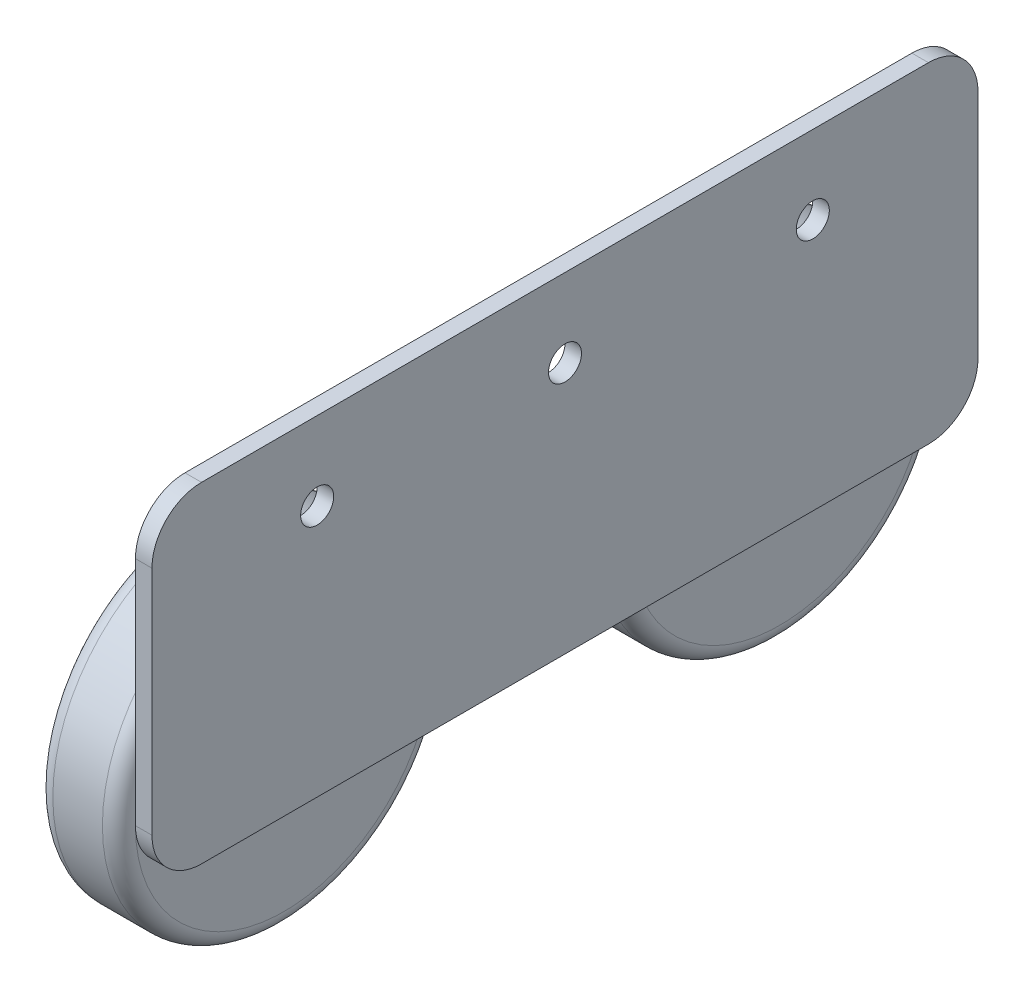
ISO-10303-21;
HEADER;
FILE_DESCRIPTION(('STEP AP214'),'2;1');
FILE_NAME('part.step','',(''),(''),'','','');
FILE_SCHEMA(('AUTOMOTIVE_DESIGN { 1 0 10303 214 1 1 1 1 }'));
ENDSEC;
DATA;
#1=APPLICATION_CONTEXT('core data for automotive mechanical design processes');
#2=APPLICATION_PROTOCOL_DEFINITION('international standard','automotive_design',2000,#1);
#3=PRODUCT_CONTEXT('',#1,'mechanical');
#4=PRODUCT('Part','Part','',(#3));
#5=PRODUCT_RELATED_PRODUCT_CATEGORY('part','',(#4));
#6=PRODUCT_DEFINITION_FORMATION('','',#4);
#7=PRODUCT_DEFINITION_CONTEXT('part definition',#1,'design');
#8=PRODUCT_DEFINITION('design','',#6,#7);
#9=PRODUCT_DEFINITION_SHAPE('','',#8);
#10=(LENGTH_UNIT() NAMED_UNIT(*) SI_UNIT(.MILLI.,.METRE.));
#11=(NAMED_UNIT(*) PLANE_ANGLE_UNIT() SI_UNIT($,.RADIAN.));
#12=(NAMED_UNIT(*) SI_UNIT($,.STERADIAN.) SOLID_ANGLE_UNIT());
#13=UNCERTAINTY_MEASURE_WITH_UNIT(LENGTH_MEASURE(1.E-05),#10,'distance_accuracy_value','');
#14=(GEOMETRIC_REPRESENTATION_CONTEXT(3) GLOBAL_UNCERTAINTY_ASSIGNED_CONTEXT((#13)) GLOBAL_UNIT_ASSIGNED_CONTEXT((#10,
#11,#12)) REPRESENTATION_CONTEXT('',''));
#15=CARTESIAN_POINT('',(0.,0.,0.));
#16=DIRECTION('',(0.,0.,1.));
#17=DIRECTION('',(1.,0.,0.));
#18=AXIS2_PLACEMENT_3D('',#15,#16,#17);
#19=CARTESIAN_POINT('',(-0.999999999999997,10.,50.));
#20=DIRECTION('',(1.,0.,0.));
#21=DIRECTION('',(0.,0.,-1.));
#22=AXIS2_PLACEMENT_3D('',#19,#20,#21);
#23=PLANE('',#22);
#24=CARTESIAN_POINT('',(-0.999999999999997,5.26091463908772,40.));
#25=DIRECTION('',(1.,0.,0.));
#26=DIRECTION('',(0.,0.,-1.));
#27=AXIS2_PLACEMENT_3D('',#24,#25,#26);
#28=CIRCLE('',#27,0.999999999999998);
#29=CARTESIAN_POINT('',(-0.999999999999997,5.26091463908772,39.));
#30=VERTEX_POINT('',#29);
#31=EDGE_CURVE('E390',#30,#30,#28,.T.);
#32=ORIENTED_EDGE('',*,*,#31,.T.);
#33=EDGE_LOOP('',(#32));
#34=FACE_BOUND('',#33,.T.);
#35=CARTESIAN_POINT('',(-0.999999999999997,5.26091463908772,25.));
#36=DIRECTION('',(1.,0.,0.));
#37=DIRECTION('',(0.,0.,-1.));
#38=AXIS2_PLACEMENT_3D('',#35,#36,#37);
#39=CIRCLE('',#38,1.);
#40=CARTESIAN_POINT('',(-0.999999999999997,5.26091463908772,24.));
#41=VERTEX_POINT('',#40);
#42=EDGE_CURVE('E384',#41,#41,#39,.T.);
#43=ORIENTED_EDGE('',*,*,#42,.T.);
#44=EDGE_LOOP('',(#43));
#45=FACE_BOUND('',#44,.T.);
#46=CARTESIAN_POINT('',(-0.999999999999997,5.26091463908772,10.));
#47=DIRECTION('',(1.,0.,0.));
#48=DIRECTION('',(0.,0.,-1.));
#49=AXIS2_PLACEMENT_3D('',#46,#47,#48);
#50=CIRCLE('',#49,1.);
#51=CARTESIAN_POINT('',(-0.999999999999997,5.26091463908772,9.));
#52=VERTEX_POINT('',#51);
#53=EDGE_CURVE('E378',#52,#52,#50,.T.);
#54=ORIENTED_EDGE('',*,*,#53,.T.);
#55=EDGE_LOOP('',(#54));
#56=FACE_BOUND('',#55,.T.);
#57=CARTESIAN_POINT('',(-0.999999999999997,-8.,40.));
#58=DIRECTION('',(1.,0.,0.));
#59=DIRECTION('',(0.,0.,-1.));
#60=AXIS2_PLACEMENT_3D('',#57,#58,#59);
#61=CIRCLE('',#60,1.);
#62=CARTESIAN_POINT('',(-0.999999999999997,-8.,39.));
#63=VERTEX_POINT('',#62);
#64=EDGE_CURVE('E366',#63,#63,#61,.T.);
#65=ORIENTED_EDGE('',*,*,#64,.T.);
#66=EDGE_LOOP('',(#65));
#67=FACE_BOUND('',#66,.T.);
#68=DIRECTION('',(0.,-1.,0.));
#69=VECTOR('',#68,1.);
#70=CARTESIAN_POINT('',(-0.999999999999997,10.,0.));
#71=LINE('',#70,#69);
#72=CARTESIAN_POINT('',(-0.999999999999997,7.,0.));
#73=VERTEX_POINT('',#72);
#74=CARTESIAN_POINT('',(-0.999999999999997,-7.,0.));
#75=VERTEX_POINT('',#74);
#76=EDGE_CURVE('E163',#73,#75,#71,.T.);
#77=ORIENTED_EDGE('',*,*,#76,.T.);
#78=CARTESIAN_POINT('',(-0.999999999999997,-7.,3.));
#79=DIRECTION('',(1.,0.,0.));
#80=DIRECTION('',(0.,0.,-1.));
#81=AXIS2_PLACEMENT_3D('',#78,#79,#80);
#82=CIRCLE('',#81,3.);
#83=CARTESIAN_POINT('',(-0.999999999999997,-10.,3.));
#84=VERTEX_POINT('',#83);
#85=EDGE_CURVE('E148',#75,#84,#82,.F.);
#86=ORIENTED_EDGE('',*,*,#85,.T.);
#87=DIRECTION('',(0.,0.,-1.));
#88=VECTOR('',#87,1.);
#89=CARTESIAN_POINT('',(-0.999999999999997,-10.,50.));
#90=LINE('',#89,#88);
#91=CARTESIAN_POINT('',(-0.999999999999997,-10.,47.));
#92=VERTEX_POINT('',#91);
#93=EDGE_CURVE('E123',#92,#84,#90,.T.);
#94=ORIENTED_EDGE('',*,*,#93,.F.);
#95=CARTESIAN_POINT('',(-0.999999999999997,-7.,47.));
#96=DIRECTION('',(1.,0.,0.));
#97=DIRECTION('',(0.,0.,-1.));
#98=AXIS2_PLACEMENT_3D('',#95,#96,#97);
#99=CIRCLE('',#98,3.);
#100=CARTESIAN_POINT('',(-0.999999999999997,-7.,50.));
#101=VERTEX_POINT('',#100);
#102=EDGE_CURVE('E128',#92,#101,#99,.F.);
#103=ORIENTED_EDGE('',*,*,#102,.T.);
#104=DIRECTION('',(0.,-1.,0.));
#105=VECTOR('',#104,1.);
#106=CARTESIAN_POINT('',(-0.999999999999997,10.,50.));
#107=LINE('',#106,#105);
#108=CARTESIAN_POINT('',(-0.999999999999997,7.,50.));
#109=VERTEX_POINT('',#108);
#110=EDGE_CURVE('E124',#109,#101,#107,.T.);
#111=ORIENTED_EDGE('',*,*,#110,.F.);
#112=CARTESIAN_POINT('',(-0.999999999999997,7.,47.));
#113=DIRECTION('',(1.,0.,0.));
#114=DIRECTION('',(0.,0.,-1.));
#115=AXIS2_PLACEMENT_3D('',#112,#113,#114);
#116=CIRCLE('',#115,3.);
#117=CARTESIAN_POINT('',(-0.999999999999997,10.,47.));
#118=VERTEX_POINT('',#117);
#119=EDGE_CURVE('E59',#109,#118,#116,.F.);
#120=ORIENTED_EDGE('',*,*,#119,.T.);
#121=DIRECTION('',(0.,0.,-1.));
#122=VECTOR('',#121,1.);
#123=CARTESIAN_POINT('',(-0.999999999999997,10.,50.));
#124=LINE('',#123,#122);
#125=CARTESIAN_POINT('',(-0.999999999999997,10.,3.));
#126=VERTEX_POINT('',#125);
#127=EDGE_CURVE('E173',#118,#126,#124,.T.);
#128=ORIENTED_EDGE('',*,*,#127,.T.);
#129=CARTESIAN_POINT('',(-0.999999999999997,7.,3.));
#130=DIRECTION('',(1.,0.,0.));
#131=DIRECTION('',(0.,0.,-1.));
#132=AXIS2_PLACEMENT_3D('',#129,#130,#131);
#133=CIRCLE('',#132,3.);
#134=EDGE_CURVE('E51',#126,#73,#133,.F.);
#135=ORIENTED_EDGE('',*,*,#134,.T.);
#136=EDGE_LOOP('',(#77,#86,#94,#103,#111,#120,#128,#135));
#137=FACE_BOUND('',#136,.T.);
#138=CARTESIAN_POINT('',(-0.999999999999997,-8.,10.));
#139=DIRECTION('',(1.,0.,0.));
#140=DIRECTION('',(0.,0.,-1.));
#141=AXIS2_PLACEMENT_3D('',#138,#139,#140);
#142=CIRCLE('',#141,1.);
#143=CARTESIAN_POINT('',(-0.999999999999997,-8.,9.));
#144=VERTEX_POINT('',#143);
#145=EDGE_CURVE('E178',#144,#144,#142,.F.);
#146=ORIENTED_EDGE('',*,*,#145,.F.);
#147=EDGE_LOOP('',(#146));
#148=FACE_BOUND('',#147,.T.);
#149=ADVANCED_FACE('F36',(#34,#45,#56,#67,#137,#148),#23,.F.);
#150=CARTESIAN_POINT('',(0.,10.,50.));
#151=DIRECTION('',(-1.,0.,0.));
#152=DIRECTION('',(0.,0.,1.));
#153=AXIS2_PLACEMENT_3D('',#150,#151,#152);
#154=PLANE('',#153);
#155=CARTESIAN_POINT('',(0.,5.26091463908772,40.));
#156=DIRECTION('',(-1.,0.,0.));
#157=DIRECTION('',(0.,0.,-1.));
#158=AXIS2_PLACEMENT_3D('',#155,#156,#157);
#159=CIRCLE('',#158,0.999999999999998);
#160=CARTESIAN_POINT('',(0.,5.26091463908772,39.));
#161=VERTEX_POINT('',#160);
#162=EDGE_CURVE('E392',#161,#161,#159,.T.);
#163=ORIENTED_EDGE('',*,*,#162,.T.);
#164=EDGE_LOOP('',(#163));
#165=FACE_BOUND('',#164,.T.);
#166=CARTESIAN_POINT('',(0.,5.26091463908772,25.));
#167=DIRECTION('',(-1.,0.,0.));
#168=DIRECTION('',(0.,0.,1.));
#169=AXIS2_PLACEMENT_3D('',#166,#167,#168);
#170=CIRCLE('',#169,1.);
#171=CARTESIAN_POINT('',(0.,5.26091463908772,26.));
#172=VERTEX_POINT('',#171);
#173=EDGE_CURVE('E387',#172,#172,#170,.T.);
#174=ORIENTED_EDGE('',*,*,#173,.T.);
#175=EDGE_LOOP('',(#174));
#176=FACE_BOUND('',#175,.T.);
#177=CARTESIAN_POINT('',(0.,5.26091463908772,10.));
#178=DIRECTION('',(-1.,0.,0.));
#179=DIRECTION('',(0.,0.,1.));
#180=AXIS2_PLACEMENT_3D('',#177,#178,#179);
#181=CIRCLE('',#180,1.);
#182=CARTESIAN_POINT('',(0.,5.26091463908772,11.));
#183=VERTEX_POINT('',#182);
#184=EDGE_CURVE('E381',#183,#183,#181,.T.);
#185=ORIENTED_EDGE('',*,*,#184,.T.);
#186=EDGE_LOOP('',(#185));
#187=FACE_BOUND('',#186,.T.);
#188=DIRECTION('',(0.,0.,-1.));
#189=VECTOR('',#188,1.);
#190=CARTESIAN_POINT('',(0.,-10.,50.));
#191=LINE('',#190,#189);
#192=CARTESIAN_POINT('',(0.,-10.,47.));
#193=VERTEX_POINT('',#192);
#194=CARTESIAN_POINT('',(0.,-10.,3.));
#195=VERTEX_POINT('',#194);
#196=EDGE_CURVE('E106',#193,#195,#191,.T.);
#197=ORIENTED_EDGE('',*,*,#196,.T.);
#198=CARTESIAN_POINT('',(0.,-7.,3.));
#199=DIRECTION('',(-1.,0.,0.));
#200=DIRECTION('',(0.,0.,1.));
#201=AXIS2_PLACEMENT_3D('',#198,#199,#200);
#202=CIRCLE('',#201,3.);
#203=CARTESIAN_POINT('',(0.,-7.,0.));
#204=VERTEX_POINT('',#203);
#205=EDGE_CURVE('E139',#195,#204,#202,.F.);
#206=ORIENTED_EDGE('',*,*,#205,.T.);
#207=DIRECTION('',(0.,1.,0.));
#208=VECTOR('',#207,1.);
#209=CARTESIAN_POINT('',(0.,10.,0.));
#210=LINE('',#209,#208);
#211=CARTESIAN_POINT('',(0.,7.,0.));
#212=VERTEX_POINT('',#211);
#213=EDGE_CURVE('E167',#204,#212,#210,.T.);
#214=ORIENTED_EDGE('',*,*,#213,.T.);
#215=CARTESIAN_POINT('',(0.,7.,3.));
#216=DIRECTION('',(-1.,0.,0.));
#217=DIRECTION('',(0.,0.,1.));
#218=AXIS2_PLACEMENT_3D('',#215,#216,#217);
#219=CIRCLE('',#218,3.);
#220=CARTESIAN_POINT('',(0.,10.,3.));
#221=VERTEX_POINT('',#220);
#222=EDGE_CURVE('E112',#212,#221,#219,.F.);
#223=ORIENTED_EDGE('',*,*,#222,.T.);
#224=DIRECTION('',(0.,0.,-1.));
#225=VECTOR('',#224,1.);
#226=CARTESIAN_POINT('',(0.,10.,50.));
#227=LINE('',#226,#225);
#228=CARTESIAN_POINT('',(0.,10.,47.));
#229=VERTEX_POINT('',#228);
#230=EDGE_CURVE('E175',#229,#221,#227,.T.);
#231=ORIENTED_EDGE('',*,*,#230,.F.);
#232=CARTESIAN_POINT('',(0.,7.,47.));
#233=DIRECTION('',(-1.,0.,0.));
#234=DIRECTION('',(0.,0.,1.));
#235=AXIS2_PLACEMENT_3D('',#232,#233,#234);
#236=CIRCLE('',#235,3.);
#237=CARTESIAN_POINT('',(0.,7.,50.));
#238=VERTEX_POINT('',#237);
#239=EDGE_CURVE('E113',#229,#238,#236,.F.);
#240=ORIENTED_EDGE('',*,*,#239,.T.);
#241=DIRECTION('',(0.,1.,0.));
#242=VECTOR('',#241,1.);
#243=CARTESIAN_POINT('',(0.,10.,50.));
#244=LINE('',#243,#242);
#245=CARTESIAN_POINT('',(0.,-7.,50.));
#246=VERTEX_POINT('',#245);
#247=EDGE_CURVE('E108',#246,#238,#244,.T.);
#248=ORIENTED_EDGE('',*,*,#247,.F.);
#249=CARTESIAN_POINT('',(0.,-7.,47.));
#250=DIRECTION('',(-1.,0.,0.));
#251=DIRECTION('',(0.,0.,1.));
#252=AXIS2_PLACEMENT_3D('',#249,#250,#251);
#253=CIRCLE('',#252,3.);
#254=EDGE_CURVE('E103',#246,#193,#253,.F.);
#255=ORIENTED_EDGE('',*,*,#254,.T.);
#256=EDGE_LOOP('',(#197,#206,#214,#223,#231,#240,#248,#255));
#257=FACE_BOUND('',#256,.T.);
#258=ADVANCED_FACE('F105',(#165,#176,#187,#257),#154,.F.);
#259=CARTESIAN_POINT('',(0.,10.,50.));
#260=DIRECTION('',(0.,-1.,0.));
#261=DIRECTION('',(0.,0.,-1.));
#262=AXIS2_PLACEMENT_3D('',#259,#260,#261);
#263=PLANE('',#262);
#264=ORIENTED_EDGE('',*,*,#230,.T.);
#265=DIRECTION('',(-1.,0.,0.));
#266=VECTOR('',#265,1.);
#267=CARTESIAN_POINT('',(-0.999999999999997,10.,3.));
#268=LINE('',#267,#266);
#269=EDGE_CURVE('E152',#221,#126,#268,.T.);
#270=ORIENTED_EDGE('',*,*,#269,.T.);
#271=ORIENTED_EDGE('',*,*,#127,.F.);
#272=DIRECTION('',(-1.,0.,0.));
#273=VECTOR('',#272,1.);
#274=CARTESIAN_POINT('',(0.,10.,47.));
#275=LINE('',#274,#273);
#276=EDGE_CURVE('E150',#118,#229,#275,.F.);
#277=ORIENTED_EDGE('',*,*,#276,.T.);
#278=EDGE_LOOP('',(#264,#270,#271,#277));
#279=FACE_BOUND('',#278,.T.);
#280=ADVANCED_FACE('F263',(#279),#263,.F.);
#281=CARTESIAN_POINT('',(0.,-10.,50.));
#282=DIRECTION('',(0.,1.,0.));
#283=DIRECTION('',(0.,0.,1.));
#284=AXIS2_PLACEMENT_3D('',#281,#282,#283);
#285=PLANE('',#284);
#286=ORIENTED_EDGE('',*,*,#93,.T.);
#287=DIRECTION('',(1.,0.,0.));
#288=VECTOR('',#287,1.);
#289=CARTESIAN_POINT('',(0.,-10.,3.));
#290=LINE('',#289,#288);
#291=EDGE_CURVE('E122',#84,#195,#290,.T.);
#292=ORIENTED_EDGE('',*,*,#291,.T.);
#293=ORIENTED_EDGE('',*,*,#196,.F.);
#294=DIRECTION('',(1.,0.,0.));
#295=VECTOR('',#294,1.);
#296=CARTESIAN_POINT('',(0.,-10.,47.));
#297=LINE('',#296,#295);
#298=EDGE_CURVE('E119',#193,#92,#297,.F.);
#299=ORIENTED_EDGE('',*,*,#298,.T.);
#300=EDGE_LOOP('',(#286,#292,#293,#299));
#301=FACE_BOUND('',#300,.T.);
#302=ADVANCED_FACE('F118',(#301),#285,.F.);
#303=CARTESIAN_POINT('',(0.,0.,50.));
#304=DIRECTION('',(0.,0.,-1.));
#305=DIRECTION('',(-1.,0.,0.));
#306=AXIS2_PLACEMENT_3D('',#303,#304,#305);
#307=PLANE('',#306);
#308=ORIENTED_EDGE('',*,*,#110,.T.);
#309=DIRECTION('',(1.,0.,0.));
#310=VECTOR('',#309,1.);
#311=CARTESIAN_POINT('',(0.,-7.,50.));
#312=LINE('',#311,#310);
#313=EDGE_CURVE('E12',#101,#246,#312,.T.);
#314=ORIENTED_EDGE('',*,*,#313,.T.);
#315=ORIENTED_EDGE('',*,*,#247,.T.);
#316=DIRECTION('',(-1.,0.,0.));
#317=VECTOR('',#316,1.);
#318=CARTESIAN_POINT('',(0.,7.,50.));
#319=LINE('',#318,#317);
#320=EDGE_CURVE('E44',#238,#109,#319,.T.);
#321=ORIENTED_EDGE('',*,*,#320,.T.);
#322=EDGE_LOOP('',(#308,#314,#315,#321));
#323=FACE_BOUND('',#322,.T.);
#324=ADVANCED_FACE('F157',(#323),#307,.F.);
#325=CARTESIAN_POINT('',(0.,0.,0.));
#326=DIRECTION('',(0.,0.,-1.));
#327=DIRECTION('',(-1.,0.,0.));
#328=AXIS2_PLACEMENT_3D('',#325,#326,#327);
#329=PLANE('',#328);
#330=ORIENTED_EDGE('',*,*,#213,.F.);
#331=DIRECTION('',(1.,0.,0.));
#332=VECTOR('',#331,1.);
#333=CARTESIAN_POINT('',(-0.999999999999997,-7.,0.));
#334=LINE('',#333,#332);
#335=EDGE_CURVE('E143',#204,#75,#334,.F.);
#336=ORIENTED_EDGE('',*,*,#335,.T.);
#337=ORIENTED_EDGE('',*,*,#76,.F.);
#338=DIRECTION('',(-1.,0.,0.));
#339=VECTOR('',#338,1.);
#340=CARTESIAN_POINT('',(0.,7.,0.));
#341=LINE('',#340,#339);
#342=EDGE_CURVE('E141',#73,#212,#341,.F.);
#343=ORIENTED_EDGE('',*,*,#342,.T.);
#344=EDGE_LOOP('',(#330,#336,#337,#343));
#345=FACE_BOUND('',#344,.T.);
#346=ADVANCED_FACE('F327',(#345),#329,.T.);
#347=CARTESIAN_POINT('',(-2.,-8.,10.));
#348=DIRECTION('',(1.,0.,0.));
#349=DIRECTION('',(0.,0.,-1.));
#350=AXIS2_PLACEMENT_3D('',#347,#348,#349);
#351=CYLINDRICAL_SURFACE('',#350,1.);
#352=CARTESIAN_POINT('',(-2.,-8.,10.));
#353=DIRECTION('',(-1.,0.,0.));
#354=DIRECTION('',(0.,0.,1.));
#355=AXIS2_PLACEMENT_3D('',#352,#353,#354);
#356=CIRCLE('',#355,1.);
#357=CARTESIAN_POINT('',(-2.,-8.,11.));
#358=VERTEX_POINT('',#357);
#359=EDGE_CURVE('E170',#358,#358,#356,.T.);
#360=ORIENTED_EDGE('',*,*,#359,.F.);
#361=EDGE_LOOP('',(#360));
#362=FACE_BOUND('',#361,.T.);
#363=ORIENTED_EDGE('',*,*,#145,.T.);
#364=EDGE_LOOP('',(#363));
#365=FACE_BOUND('',#364,.T.);
#366=ADVANCED_FACE('F331',(#362,#365),#351,.T.);
#367=CARTESIAN_POINT('',(-2.,-8.,10.));
#368=DIRECTION('',(-1.,0.,0.));
#369=DIRECTION('',(0.,0.,1.));
#370=AXIS2_PLACEMENT_3D('',#367,#368,#369);
#371=PLANE('',#370);
#372=CARTESIAN_POINT('',(-2.,-8.,10.));
#373=DIRECTION('',(-1.,0.,0.));
#374=DIRECTION('',(0.,0.,1.));
#375=AXIS2_PLACEMENT_3D('',#372,#373,#374);
#376=CIRCLE('',#375,9.);
#377=CARTESIAN_POINT('',(-2.,-8.,19.));
#378=VERTEX_POINT('',#377);
#379=EDGE_CURVE('E193',#378,#378,#376,.F.);
#380=ORIENTED_EDGE('',*,*,#379,.T.);
#381=EDGE_LOOP('',(#380));
#382=FACE_BOUND('',#381,.T.);
#383=ORIENTED_EDGE('',*,*,#359,.T.);
#384=EDGE_LOOP('',(#383));
#385=FACE_BOUND('',#384,.T.);
#386=ADVANCED_FACE('F336',(#382,#385),#371,.F.);
#387=CARTESIAN_POINT('',(-7.,-8.,10.));
#388=DIRECTION('',(1.,0.,0.));
#389=DIRECTION('',(0.,0.,-1.));
#390=AXIS2_PLACEMENT_3D('',#387,#388,#389);
#391=CYLINDRICAL_SURFACE('',#390,10.);
#392=CARTESIAN_POINT('',(-3.,-8.,10.));
#393=DIRECTION('',(-1.,0.,0.));
#394=DIRECTION('',(0.,0.,1.));
#395=AXIS2_PLACEMENT_3D('',#392,#393,#394);
#396=CIRCLE('',#395,10.);
#397=CARTESIAN_POINT('',(-3.,-8.,20.));
#398=VERTEX_POINT('',#397);
#399=EDGE_CURVE('E190',#398,#398,#396,.T.);
#400=ORIENTED_EDGE('',*,*,#399,.T.);
#401=EDGE_LOOP('',(#400));
#402=FACE_BOUND('',#401,.T.);
#403=CARTESIAN_POINT('',(-6.,-8.,10.));
#404=DIRECTION('',(-1.,0.,0.));
#405=DIRECTION('',(0.,0.,1.));
#406=AXIS2_PLACEMENT_3D('',#403,#404,#405);
#407=CIRCLE('',#406,10.);
#408=CARTESIAN_POINT('',(-6.,-8.,20.));
#409=VERTEX_POINT('',#408);
#410=EDGE_CURVE('E187',#409,#409,#407,.F.);
#411=ORIENTED_EDGE('',*,*,#410,.T.);
#412=EDGE_LOOP('',(#411));
#413=FACE_BOUND('',#412,.T.);
#414=ADVANCED_FACE('F341',(#402,#413),#391,.T.);
#415=CARTESIAN_POINT('',(20.6274169979695,-8.,10.));
#416=DIRECTION('',(-1.,0.,0.));
#417=DIRECTION('',(0.,0.,1.));
#418=AXIS2_PLACEMENT_3D('',#415,#416,#417);
#419=CYLINDRICAL_SURFACE('',#418,1.5);
#420=CARTESIAN_POINT('',(-6.,-8.,10.));
#421=DIRECTION('',(-1.,0.,0.));
#422=DIRECTION('',(0.,0.,1.));
#423=AXIS2_PLACEMENT_3D('',#420,#421,#422);
#424=CIRCLE('',#423,1.5);
#425=CARTESIAN_POINT('',(-6.,-8.,11.5));
#426=VERTEX_POINT('',#425);
#427=EDGE_CURVE('E184',#426,#426,#424,.F.);
#428=ORIENTED_EDGE('',*,*,#427,.T.);
#429=EDGE_LOOP('',(#428));
#430=FACE_BOUND('',#429,.T.);
#431=CARTESIAN_POINT('',(-5.,-8.,10.));
#432=DIRECTION('',(-1.,0.,0.));
#433=DIRECTION('',(0.,0.,1.));
#434=AXIS2_PLACEMENT_3D('',#431,#432,#433);
#435=CIRCLE('',#434,1.5);
#436=CARTESIAN_POINT('',(-5.,-8.,11.5));
#437=VERTEX_POINT('',#436);
#438=EDGE_CURVE('E364',#437,#437,#435,.F.);
#439=ORIENTED_EDGE('',*,*,#438,.F.);
#440=EDGE_LOOP('',(#439));
#441=FACE_BOUND('',#440,.T.);
#442=ADVANCED_FACE('F344',(#430,#441),#419,.T.);
#443=CARTESIAN_POINT('',(-5.,-8.,10.));
#444=DIRECTION('',(-1.,0.,0.));
#445=DIRECTION('',(0.,0.,1.));
#446=AXIS2_PLACEMENT_3D('',#443,#444,#445);
#447=PLANE('',#446);
#448=CARTESIAN_POINT('',(-5.,-8.,10.));
#449=DIRECTION('',(-1.,0.,0.));
#450=DIRECTION('',(0.,0.,1.));
#451=AXIS2_PLACEMENT_3D('',#448,#449,#450);
#452=CIRCLE('',#451,7.);
#453=CARTESIAN_POINT('',(-5.,-8.,17.));
#454=VERTEX_POINT('',#453);
#455=EDGE_CURVE('E202',#454,#454,#452,.T.);
#456=ORIENTED_EDGE('',*,*,#455,.T.);
#457=EDGE_LOOP('',(#456));
#458=FACE_BOUND('',#457,.T.);
#459=ORIENTED_EDGE('',*,*,#438,.T.);
#460=EDGE_LOOP('',(#459));
#461=FACE_BOUND('',#460,.T.);
#462=ADVANCED_FACE('F351',(#458,#461),#447,.T.);
#463=CARTESIAN_POINT('',(-7.,-8.,10.));
#464=DIRECTION('',(-1.,0.,0.));
#465=DIRECTION('',(0.,0.,1.));
#466=AXIS2_PLACEMENT_3D('',#463,#464,#465);
#467=PLANE('',#466);
#468=CARTESIAN_POINT('',(-7.,-8.,10.));
#469=DIRECTION('',(-1.,0.,0.));
#470=DIRECTION('',(0.,0.,1.));
#471=AXIS2_PLACEMENT_3D('',#468,#469,#470);
#472=CIRCLE('',#471,0.499999999999999);
#473=CARTESIAN_POINT('',(-7.,-8.,10.5));
#474=VERTEX_POINT('',#473);
#475=EDGE_CURVE('E181',#474,#474,#472,.T.);
#476=ORIENTED_EDGE('',*,*,#475,.T.);
#477=EDGE_LOOP('',(#476));
#478=FACE_BOUND('',#477,.T.);
#479=ADVANCED_FACE('F278',(#478),#467,.T.);
#480=CARTESIAN_POINT('',(-6.,-8.,10.));
#481=DIRECTION('',(-1.,0.,0.));
#482=DIRECTION('',(0.,0.,1.));
#483=AXIS2_PLACEMENT_3D('',#480,#481,#482);
#484=DEGENERATE_TOROIDAL_SURFACE('',#483,0.499999999999999,1.,.T.);
#485=ORIENTED_EDGE('',*,*,#427,.F.);
#486=EDGE_LOOP('',(#485));
#487=FACE_BOUND('',#486,.T.);
#488=ORIENTED_EDGE('',*,*,#475,.F.);
#489=EDGE_LOOP('',(#488));
#490=FACE_BOUND('',#489,.T.);
#491=ADVANCED_FACE('F274',(#487,#490),#484,.T.);
#492=CARTESIAN_POINT('',(-3.,-8.,10.));
#493=DIRECTION('',(-1.,0.,0.));
#494=DIRECTION('',(0.,0.,1.));
#495=AXIS2_PLACEMENT_3D('',#492,#493,#494);
#496=TOROIDAL_SURFACE('',#495,9.,1.);
#497=ORIENTED_EDGE('',*,*,#379,.F.);
#498=EDGE_LOOP('',(#497));
#499=FACE_BOUND('',#498,.T.);
#500=ORIENTED_EDGE('',*,*,#399,.F.);
#501=EDGE_LOOP('',(#500));
#502=FACE_BOUND('',#501,.T.);
#503=ADVANCED_FACE('F277',(#499,#502),#496,.T.);
#504=CARTESIAN_POINT('',(-6.,-8.,10.));
#505=DIRECTION('',(-1.,0.,0.));
#506=DIRECTION('',(0.,0.,1.));
#507=AXIS2_PLACEMENT_3D('',#504,#505,#506);
#508=TOROIDAL_SURFACE('',#507,9.,1.);
#509=ORIENTED_EDGE('',*,*,#410,.F.);
#510=EDGE_LOOP('',(#509));
#511=FACE_BOUND('',#510,.T.);
#512=CARTESIAN_POINT('',(-7.,-8.,10.));
#513=DIRECTION('',(-1.,0.,0.));
#514=DIRECTION('',(0.,0.,1.));
#515=AXIS2_PLACEMENT_3D('',#512,#513,#514);
#516=CIRCLE('',#515,9.);
#517=CARTESIAN_POINT('',(-7.,-8.,19.));
#518=VERTEX_POINT('',#517);
#519=EDGE_CURVE('E196',#518,#518,#516,.T.);
#520=ORIENTED_EDGE('',*,*,#519,.F.);
#521=EDGE_LOOP('',(#520));
#522=FACE_BOUND('',#521,.T.);
#523=ADVANCED_FACE('F282',(#511,#522),#508,.T.);
#524=CARTESIAN_POINT('',(-6.,-8.,10.));
#525=DIRECTION('',(-1.,0.,0.));
#526=DIRECTION('',(0.,0.,1.));
#527=AXIS2_PLACEMENT_3D('',#524,#525,#526);
#528=TOROIDAL_SURFACE('',#527,9.00000000000001,1.);
#529=ORIENTED_EDGE('',*,*,#519,.T.);
#530=EDGE_LOOP('',(#529));
#531=FACE_BOUND('',#530,.T.);
#532=CARTESIAN_POINT('',(-6.,-8.,10.));
#533=DIRECTION('',(-1.,0.,0.));
#534=DIRECTION('',(0.,0.,1.));
#535=AXIS2_PLACEMENT_3D('',#532,#533,#534);
#536=CIRCLE('',#535,8.);
#537=CARTESIAN_POINT('',(-6.,-8.,18.));
#538=VERTEX_POINT('',#537);
#539=EDGE_CURVE('E199',#538,#538,#536,.T.);
#540=ORIENTED_EDGE('',*,*,#539,.F.);
#541=EDGE_LOOP('',(#540));
#542=FACE_BOUND('',#541,.T.);
#543=ADVANCED_FACE('F286',(#531,#542),#528,.T.);
#544=CARTESIAN_POINT('',(-6.,-8.,10.));
#545=DIRECTION('',(-1.,0.,0.));
#546=DIRECTION('',(0.,0.,1.));
#547=AXIS2_PLACEMENT_3D('',#544,#545,#546);
#548=TOROIDAL_SURFACE('',#547,7.,1.);
#549=ORIENTED_EDGE('',*,*,#455,.F.);
#550=EDGE_LOOP('',(#549));
#551=FACE_BOUND('',#550,.T.);
#552=ORIENTED_EDGE('',*,*,#539,.T.);
#553=EDGE_LOOP('',(#552));
#554=FACE_BOUND('',#553,.T.);
#555=ADVANCED_FACE('F254',(#551,#554),#548,.F.);
#556=CARTESIAN_POINT('',(-2.,-8.,40.));
#557=DIRECTION('',(1.,0.,0.));
#558=DIRECTION('',(0.,0.,-1.));
#559=AXIS2_PLACEMENT_3D('',#556,#557,#558);
#560=CYLINDRICAL_SURFACE('',#559,1.);
#561=CARTESIAN_POINT('',(-2.,-8.,40.));
#562=DIRECTION('',(-1.,0.,0.));
#563=DIRECTION('',(0.,0.,1.));
#564=AXIS2_PLACEMENT_3D('',#561,#562,#563);
#565=CIRCLE('',#564,1.);
#566=CARTESIAN_POINT('',(-2.,-8.,41.));
#567=VERTEX_POINT('',#566);
#568=EDGE_CURVE('E370',#567,#567,#565,.F.);
#569=ORIENTED_EDGE('',*,*,#568,.T.);
#570=EDGE_LOOP('',(#569));
#571=FACE_BOUND('',#570,.T.);
#572=ORIENTED_EDGE('',*,*,#64,.F.);
#573=EDGE_LOOP('',(#572));
#574=FACE_BOUND('',#573,.T.);
#575=ADVANCED_FACE('F244',(#571,#574),#560,.T.);
#576=CARTESIAN_POINT('',(-7.,-8.,40.));
#577=DIRECTION('',(1.,0.,0.));
#578=DIRECTION('',(0.,0.,-1.));
#579=AXIS2_PLACEMENT_3D('',#576,#577,#578);
#580=CYLINDRICAL_SURFACE('',#579,10.);
#581=CARTESIAN_POINT('',(-3.,-8.,40.));
#582=DIRECTION('',(-1.,0.,0.));
#583=DIRECTION('',(0.,0.,1.));
#584=AXIS2_PLACEMENT_3D('',#581,#582,#583);
#585=CIRCLE('',#584,10.);
#586=CARTESIAN_POINT('',(-3.,-8.,50.));
#587=VERTEX_POINT('',#586);
#588=EDGE_CURVE('E217',#587,#587,#585,.T.);
#589=ORIENTED_EDGE('',*,*,#588,.T.);
#590=EDGE_LOOP('',(#589));
#591=FACE_BOUND('',#590,.T.);
#592=CARTESIAN_POINT('',(-6.,-8.,40.));
#593=DIRECTION('',(-1.,0.,0.));
#594=DIRECTION('',(0.,0.,1.));
#595=AXIS2_PLACEMENT_3D('',#592,#593,#594);
#596=CIRCLE('',#595,10.);
#597=CARTESIAN_POINT('',(-6.,-8.,50.));
#598=VERTEX_POINT('',#597);
#599=EDGE_CURVE('E214',#598,#598,#596,.F.);
#600=ORIENTED_EDGE('',*,*,#599,.T.);
#601=EDGE_LOOP('',(#600));
#602=FACE_BOUND('',#601,.T.);
#603=ADVANCED_FACE('F241',(#591,#602),#580,.T.);
#604=CARTESIAN_POINT('',(-2.,-8.,40.));
#605=DIRECTION('',(-1.,0.,0.));
#606=DIRECTION('',(0.,0.,-1.));
#607=AXIS2_PLACEMENT_3D('',#604,#605,#606);
#608=PLANE('',#607);
#609=CARTESIAN_POINT('',(-2.,-8.,40.));
#610=DIRECTION('',(-1.,0.,0.));
#611=DIRECTION('',(0.,0.,1.));
#612=AXIS2_PLACEMENT_3D('',#609,#610,#611);
#613=CIRCLE('',#612,9.);
#614=CARTESIAN_POINT('',(-2.,-8.,49.));
#615=VERTEX_POINT('',#614);
#616=EDGE_CURVE('E211',#615,#615,#613,.F.);
#617=ORIENTED_EDGE('',*,*,#616,.T.);
#618=EDGE_LOOP('',(#617));
#619=FACE_BOUND('',#618,.T.);
#620=ORIENTED_EDGE('',*,*,#568,.F.);
#621=EDGE_LOOP('',(#620));
#622=FACE_BOUND('',#621,.T.);
#623=ADVANCED_FACE('F243',(#619,#622),#608,.F.);
#624=CARTESIAN_POINT('',(20.6274169979695,-8.,40.));
#625=DIRECTION('',(-1.,0.,0.));
#626=DIRECTION('',(0.,0.,1.));
#627=AXIS2_PLACEMENT_3D('',#624,#625,#626);
#628=CYLINDRICAL_SURFACE('',#627,1.5);
#629=CARTESIAN_POINT('',(-6.,-8.,40.));
#630=DIRECTION('',(-1.,0.,0.));
#631=DIRECTION('',(0.,0.,1.));
#632=AXIS2_PLACEMENT_3D('',#629,#630,#631);
#633=CIRCLE('',#632,1.5);
#634=CARTESIAN_POINT('',(-6.,-8.,41.5));
#635=VERTEX_POINT('',#634);
#636=EDGE_CURVE('E205',#635,#635,#633,.F.);
#637=ORIENTED_EDGE('',*,*,#636,.T.);
#638=EDGE_LOOP('',(#637));
#639=FACE_BOUND('',#638,.T.);
#640=CARTESIAN_POINT('',(-5.,-8.,40.));
#641=DIRECTION('',(-1.,0.,0.));
#642=DIRECTION('',(0.,0.,1.));
#643=AXIS2_PLACEMENT_3D('',#640,#641,#642);
#644=CIRCLE('',#643,1.5);
#645=CARTESIAN_POINT('',(-5.,-8.,41.5));
#646=VERTEX_POINT('',#645);
#647=EDGE_CURVE('E375',#646,#646,#644,.T.);
#648=ORIENTED_EDGE('',*,*,#647,.T.);
#649=EDGE_LOOP('',(#648));
#650=FACE_BOUND('',#649,.T.);
#651=ADVANCED_FACE('F251',(#639,#650),#628,.T.);
#652=CARTESIAN_POINT('',(-5.,-8.,10.));
#653=DIRECTION('',(-1.,0.,0.));
#654=DIRECTION('',(0.,0.,1.));
#655=AXIS2_PLACEMENT_3D('',#652,#653,#654);
#656=PLANE('',#655);
#657=CARTESIAN_POINT('',(-5.,-8.,40.));
#658=DIRECTION('',(-1.,0.,0.));
#659=DIRECTION('',(0.,0.,1.));
#660=AXIS2_PLACEMENT_3D('',#657,#658,#659);
#661=CIRCLE('',#660,7.);
#662=CARTESIAN_POINT('',(-5.,-8.,47.));
#663=VERTEX_POINT('',#662);
#664=EDGE_CURVE('E129',#663,#663,#661,.T.);
#665=ORIENTED_EDGE('',*,*,#664,.T.);
#666=EDGE_LOOP('',(#665));
#667=FACE_BOUND('',#666,.T.);
#668=ORIENTED_EDGE('',*,*,#647,.F.);
#669=EDGE_LOOP('',(#668));
#670=FACE_BOUND('',#669,.T.);
#671=ADVANCED_FACE('F410',(#667,#670),#656,.T.);
#672=CARTESIAN_POINT('',(-7.,-8.,40.));
#673=DIRECTION('',(-1.,0.,0.));
#674=DIRECTION('',(0.,0.,-1.));
#675=AXIS2_PLACEMENT_3D('',#672,#673,#674);
#676=PLANE('',#675);
#677=CARTESIAN_POINT('',(-7.,-8.,40.));
#678=DIRECTION('',(-1.,0.,0.));
#679=DIRECTION('',(0.,0.,1.));
#680=AXIS2_PLACEMENT_3D('',#677,#678,#679);
#681=CIRCLE('',#680,0.499999999999999);
#682=CARTESIAN_POINT('',(-7.,-8.,40.5));
#683=VERTEX_POINT('',#682);
#684=EDGE_CURVE('E208',#683,#683,#681,.T.);
#685=ORIENTED_EDGE('',*,*,#684,.T.);
#686=EDGE_LOOP('',(#685));
#687=FACE_BOUND('',#686,.T.);
#688=ADVANCED_FACE('F297',(#687),#676,.T.);
#689=CARTESIAN_POINT('',(-6.,-8.,40.));
#690=DIRECTION('',(-1.,0.,0.));
#691=DIRECTION('',(0.,0.,1.));
#692=AXIS2_PLACEMENT_3D('',#689,#690,#691);
#693=DEGENERATE_TOROIDAL_SURFACE('',#692,0.499999999999999,1.,.T.);
#694=ORIENTED_EDGE('',*,*,#684,.F.);
#695=EDGE_LOOP('',(#694));
#696=FACE_BOUND('',#695,.T.);
#697=ORIENTED_EDGE('',*,*,#636,.F.);
#698=EDGE_LOOP('',(#697));
#699=FACE_BOUND('',#698,.T.);
#700=ADVANCED_FACE('F294',(#696,#699),#693,.T.);
#701=CARTESIAN_POINT('',(-3.,-8.,40.));
#702=DIRECTION('',(-1.,0.,0.));
#703=DIRECTION('',(0.,0.,1.));
#704=AXIS2_PLACEMENT_3D('',#701,#702,#703);
#705=TOROIDAL_SURFACE('',#704,9.,1.);
#706=ORIENTED_EDGE('',*,*,#588,.F.);
#707=EDGE_LOOP('',(#706));
#708=FACE_BOUND('',#707,.T.);
#709=ORIENTED_EDGE('',*,*,#616,.F.);
#710=EDGE_LOOP('',(#709));
#711=FACE_BOUND('',#710,.T.);
#712=ADVANCED_FACE('F237',(#708,#711),#705,.T.);
#713=CARTESIAN_POINT('',(-6.,-8.,40.));
#714=DIRECTION('',(-1.,0.,0.));
#715=DIRECTION('',(0.,0.,1.));
#716=AXIS2_PLACEMENT_3D('',#713,#714,#715);
#717=TOROIDAL_SURFACE('',#716,9.,1.);
#718=CARTESIAN_POINT('',(-7.,-8.,40.));
#719=DIRECTION('',(-1.,0.,0.));
#720=DIRECTION('',(0.,0.,1.));
#721=AXIS2_PLACEMENT_3D('',#718,#719,#720);
#722=CIRCLE('',#721,9.);
#723=CARTESIAN_POINT('',(-7.,-8.,49.));
#724=VERTEX_POINT('',#723);
#725=EDGE_CURVE('E220',#724,#724,#722,.T.);
#726=ORIENTED_EDGE('',*,*,#725,.F.);
#727=EDGE_LOOP('',(#726));
#728=FACE_BOUND('',#727,.T.);
#729=ORIENTED_EDGE('',*,*,#599,.F.);
#730=EDGE_LOOP('',(#729));
#731=FACE_BOUND('',#730,.T.);
#732=ADVANCED_FACE('F231',(#728,#731),#717,.T.);
#733=CARTESIAN_POINT('',(-6.,-8.,40.));
#734=DIRECTION('',(-1.,0.,0.));
#735=DIRECTION('',(0.,0.,1.));
#736=AXIS2_PLACEMENT_3D('',#733,#734,#735);
#737=TOROIDAL_SURFACE('',#736,9.00000000000001,1.);
#738=CARTESIAN_POINT('',(-6.,-8.,40.));
#739=DIRECTION('',(-1.,0.,0.));
#740=DIRECTION('',(0.,0.,1.));
#741=AXIS2_PLACEMENT_3D('',#738,#739,#740);
#742=CIRCLE('',#741,8.);
#743=CARTESIAN_POINT('',(-6.,-8.,48.));
#744=VERTEX_POINT('',#743);
#745=EDGE_CURVE('E133',#744,#744,#742,.T.);
#746=ORIENTED_EDGE('',*,*,#745,.F.);
#747=EDGE_LOOP('',(#746));
#748=FACE_BOUND('',#747,.T.);
#749=ORIENTED_EDGE('',*,*,#725,.T.);
#750=EDGE_LOOP('',(#749));
#751=FACE_BOUND('',#750,.T.);
#752=ADVANCED_FACE('F228',(#748,#751),#737,.T.);
#753=CARTESIAN_POINT('',(-6.,-8.,40.));
#754=DIRECTION('',(-1.,0.,0.));
#755=DIRECTION('',(0.,0.,1.));
#756=AXIS2_PLACEMENT_3D('',#753,#754,#755);
#757=TOROIDAL_SURFACE('',#756,7.,1.);
#758=ORIENTED_EDGE('',*,*,#745,.T.);
#759=EDGE_LOOP('',(#758));
#760=FACE_BOUND('',#759,.T.);
#761=ORIENTED_EDGE('',*,*,#664,.F.);
#762=EDGE_LOOP('',(#761));
#763=FACE_BOUND('',#762,.T.);
#764=ADVANCED_FACE('F225',(#760,#763),#757,.F.);
#765=CARTESIAN_POINT('',(0.,-7.,3.));
#766=DIRECTION('',(-1.,0.,0.));
#767=DIRECTION('',(0.,0.,1.));
#768=AXIS2_PLACEMENT_3D('',#765,#766,#767);
#769=CYLINDRICAL_SURFACE('',#768,3.);
#770=ORIENTED_EDGE('',*,*,#85,.F.);
#771=ORIENTED_EDGE('',*,*,#335,.F.);
#772=ORIENTED_EDGE('',*,*,#205,.F.);
#773=ORIENTED_EDGE('',*,*,#291,.F.);
#774=EDGE_LOOP('',(#770,#771,#772,#773));
#775=FACE_BOUND('',#774,.T.);
#776=ADVANCED_FACE('F304',(#775),#769,.T.);
#777=CARTESIAN_POINT('',(0.,7.,3.));
#778=DIRECTION('',(1.,0.,0.));
#779=DIRECTION('',(0.,0.,-1.));
#780=AXIS2_PLACEMENT_3D('',#777,#778,#779);
#781=CYLINDRICAL_SURFACE('',#780,3.);
#782=ORIENTED_EDGE('',*,*,#222,.F.);
#783=ORIENTED_EDGE('',*,*,#342,.F.);
#784=ORIENTED_EDGE('',*,*,#134,.F.);
#785=ORIENTED_EDGE('',*,*,#269,.F.);
#786=EDGE_LOOP('',(#782,#783,#784,#785));
#787=FACE_BOUND('',#786,.T.);
#788=ADVANCED_FACE('F307',(#787),#781,.T.);
#789=CARTESIAN_POINT('',(0.,-7.,47.));
#790=DIRECTION('',(1.,0.,0.));
#791=DIRECTION('',(0.,0.,-1.));
#792=AXIS2_PLACEMENT_3D('',#789,#790,#791);
#793=CYLINDRICAL_SURFACE('',#792,3.);
#794=ORIENTED_EDGE('',*,*,#102,.F.);
#795=ORIENTED_EDGE('',*,*,#298,.F.);
#796=ORIENTED_EDGE('',*,*,#254,.F.);
#797=ORIENTED_EDGE('',*,*,#313,.F.);
#798=EDGE_LOOP('',(#794,#795,#796,#797));
#799=FACE_BOUND('',#798,.T.);
#800=ADVANCED_FACE('F127',(#799),#793,.T.);
#801=CARTESIAN_POINT('',(0.,7.,47.));
#802=DIRECTION('',(-1.,0.,0.));
#803=DIRECTION('',(0.,0.,1.));
#804=AXIS2_PLACEMENT_3D('',#801,#802,#803);
#805=CYLINDRICAL_SURFACE('',#804,3.);
#806=ORIENTED_EDGE('',*,*,#239,.F.);
#807=ORIENTED_EDGE('',*,*,#276,.F.);
#808=ORIENTED_EDGE('',*,*,#119,.F.);
#809=ORIENTED_EDGE('',*,*,#320,.F.);
#810=EDGE_LOOP('',(#806,#807,#808,#809));
#811=FACE_BOUND('',#810,.T.);
#812=ADVANCED_FACE('F38',(#811),#805,.T.);
#813=CARTESIAN_POINT('',(0.,5.26091463908772,10.));
#814=DIRECTION('',(-1.,0.,0.));
#815=DIRECTION('',(0.,0.,1.));
#816=AXIS2_PLACEMENT_3D('',#813,#814,#815);
#817=CYLINDRICAL_SURFACE('',#816,1.);
#818=ORIENTED_EDGE('',*,*,#184,.F.);
#819=EDGE_LOOP('',(#818));
#820=FACE_BOUND('',#819,.T.);
#821=ORIENTED_EDGE('',*,*,#53,.F.);
#822=EDGE_LOOP('',(#821));
#823=FACE_BOUND('',#822,.T.);
#824=ADVANCED_FACE('F314',(#820,#823),#817,.F.);
#825=CARTESIAN_POINT('',(0.,5.26091463908772,25.));
#826=DIRECTION('',(-1.,0.,0.));
#827=DIRECTION('',(0.,0.,1.));
#828=AXIS2_PLACEMENT_3D('',#825,#826,#827);
#829=CYLINDRICAL_SURFACE('',#828,1.);
#830=ORIENTED_EDGE('',*,*,#173,.F.);
#831=EDGE_LOOP('',(#830));
#832=FACE_BOUND('',#831,.T.);
#833=ORIENTED_EDGE('',*,*,#42,.F.);
#834=EDGE_LOOP('',(#833));
#835=FACE_BOUND('',#834,.T.);
#836=ADVANCED_FACE('F318',(#832,#835),#829,.F.);
#837=CARTESIAN_POINT('',(0.,5.26091463908772,40.));
#838=DIRECTION('',(-1.,0.,0.));
#839=DIRECTION('',(0.,0.,1.));
#840=AXIS2_PLACEMENT_3D('',#837,#838,#839);
#841=CYLINDRICAL_SURFACE('',#840,0.999999999999998);
#842=ORIENTED_EDGE('',*,*,#162,.F.);
#843=EDGE_LOOP('',(#842));
#844=FACE_BOUND('',#843,.T.);
#845=ORIENTED_EDGE('',*,*,#31,.F.);
#846=EDGE_LOOP('',(#845));
#847=FACE_BOUND('',#846,.T.);
#848=ADVANCED_FACE('F397',(#844,#847),#841,.F.);
#849=CLOSED_SHELL('',(#149,#258,#280,#302,#324,#346,#366,#386,#414,#442,#462,#479,#491,#503,
#523,#543,#555,#575,#603,#623,#651,#671,#688,#700,#712,#732,#752,#764,#776,#788,#800,#812,#824,
#836,#848));
#850=MANIFOLD_SOLID_BREP('B2',#849);
#851=ADVANCED_BREP_SHAPE_REPRESENTATION('',(#18,#850),#14);
#852=SHAPE_DEFINITION_REPRESENTATION(#9,#851);
ENDSEC;
END-ISO-10303-21;
